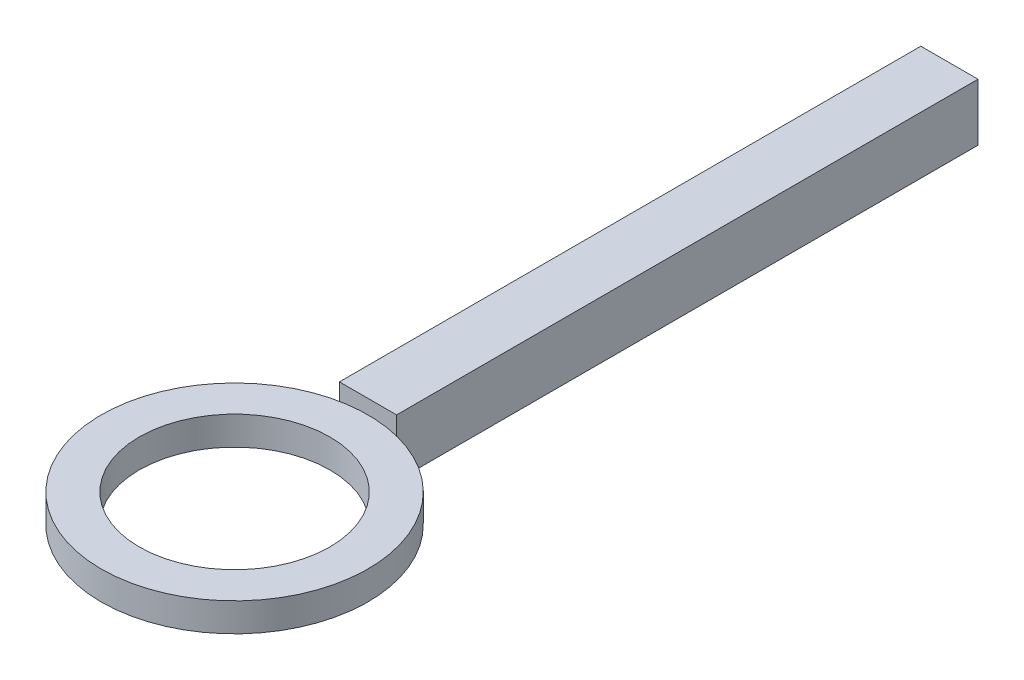
ISO-10303-21;
HEADER;
FILE_DESCRIPTION(('STEP AP214'),'2;1');
FILE_NAME('part.step','',(''),(''),'','','');
FILE_SCHEMA(('AUTOMOTIVE_DESIGN { 1 0 10303 214 1 1 1 1 }'));
ENDSEC;
DATA;
#1=APPLICATION_CONTEXT('core data for automotive mechanical design processes');
#2=APPLICATION_PROTOCOL_DEFINITION('international standard','automotive_design',2000,#1);
#3=PRODUCT_CONTEXT('',#1,'mechanical');
#4=PRODUCT('Part','Part','',(#3));
#5=PRODUCT_RELATED_PRODUCT_CATEGORY('part','',(#4));
#6=PRODUCT_DEFINITION_FORMATION('','',#4);
#7=PRODUCT_DEFINITION_CONTEXT('part definition',#1,'design');
#8=PRODUCT_DEFINITION('design','',#6,#7);
#9=PRODUCT_DEFINITION_SHAPE('','',#8);
#10=(LENGTH_UNIT() NAMED_UNIT(*) SI_UNIT(.MILLI.,.METRE.));
#11=(NAMED_UNIT(*) PLANE_ANGLE_UNIT() SI_UNIT($,.RADIAN.));
#12=(NAMED_UNIT(*) SI_UNIT($,.STERADIAN.) SOLID_ANGLE_UNIT());
#13=UNCERTAINTY_MEASURE_WITH_UNIT(LENGTH_MEASURE(1.E-05),#10,'distance_accuracy_value','');
#14=(GEOMETRIC_REPRESENTATION_CONTEXT(3) GLOBAL_UNCERTAINTY_ASSIGNED_CONTEXT((#13)) GLOBAL_UNIT_ASSIGNED_CONTEXT((#10,
#11,#12)) REPRESENTATION_CONTEXT('',''));
#15=CARTESIAN_POINT('',(0.,0.,0.));
#16=DIRECTION('',(0.,0.,1.));
#17=DIRECTION('',(1.,0.,0.));
#18=AXIS2_PLACEMENT_3D('',#15,#16,#17);
#19=CARTESIAN_POINT('',(-6.,6.,0.));
#20=DIRECTION('',(1.,0.,0.));
#21=DIRECTION('',(0.,0.,-1.));
#22=AXIS2_PLACEMENT_3D('',#19,#20,#21);
#23=PLANE('',#22);
#24=DIRECTION('',(0.,0.,1.));
#25=VECTOR('',#24,1.);
#26=CARTESIAN_POINT('',(-6.,-6.,0.));
#27=LINE('',#26,#25);
#28=CARTESIAN_POINT('',(-6.,-6.,0.));
#29=VERTEX_POINT('',#28);
#30=CARTESIAN_POINT('',(-6.,-6.,122.));
#31=VERTEX_POINT('',#30);
#32=EDGE_CURVE('E109',#29,#31,#27,.T.);
#33=ORIENTED_EDGE('',*,*,#32,.T.);
#34=DIRECTION('',(0.,-1.,0.));
#35=VECTOR('',#34,1.);
#36=CARTESIAN_POINT('',(-6.,6.,122.));
#37=LINE('',#36,#35);
#38=CARTESIAN_POINT('',(-6.,6.,122.));
#39=VERTEX_POINT('',#38);
#40=EDGE_CURVE('E12',#39,#31,#37,.T.);
#41=ORIENTED_EDGE('',*,*,#40,.F.);
#42=DIRECTION('',(0.,0.,1.));
#43=VECTOR('',#42,1.);
#44=CARTESIAN_POINT('',(-6.,6.,0.));
#45=LINE('',#44,#43);
#46=CARTESIAN_POINT('',(-6.,6.,0.));
#47=VERTEX_POINT('',#46);
#48=EDGE_CURVE('E98',#47,#39,#45,.T.);
#49=ORIENTED_EDGE('',*,*,#48,.F.);
#50=DIRECTION('',(0.,-1.,0.));
#51=VECTOR('',#50,1.);
#52=CARTESIAN_POINT('',(-6.,6.,0.));
#53=LINE('',#52,#51);
#54=EDGE_CURVE('E106',#47,#29,#53,.T.);
#55=ORIENTED_EDGE('',*,*,#54,.T.);
#56=EDGE_LOOP('',(#33,#41,#49,#55));
#57=FACE_BOUND('',#56,.T.);
#58=ADVANCED_FACE('F50',(#57),#23,.F.);
#59=CARTESIAN_POINT('',(-6.,6.,122.));
#60=DIRECTION('',(0.,0.,-1.));
#61=DIRECTION('',(-1.,0.,0.));
#62=AXIS2_PLACEMENT_3D('',#59,#60,#61);
#63=PLANE('',#62);
#64=DIRECTION('',(1.,0.,0.));
#65=VECTOR('',#64,1.);
#66=CARTESIAN_POINT('',(-6.,-6.,122.));
#67=LINE('',#66,#65);
#68=CARTESIAN_POINT('',(6.,-6.,122.));
#69=VERTEX_POINT('',#68);
#70=EDGE_CURVE('E105',#31,#69,#67,.T.);
#71=ORIENTED_EDGE('',*,*,#70,.T.);
#72=DIRECTION('',(0.,-1.,0.));
#73=VECTOR('',#72,1.);
#74=CARTESIAN_POINT('',(6.,6.,122.));
#75=LINE('',#74,#73);
#76=CARTESIAN_POINT('',(6.,6.,122.));
#77=VERTEX_POINT('',#76);
#78=EDGE_CURVE('E54',#77,#69,#75,.T.);
#79=ORIENTED_EDGE('',*,*,#78,.F.);
#80=DIRECTION('',(1.,0.,0.));
#81=VECTOR('',#80,1.);
#82=CARTESIAN_POINT('',(-6.,6.,122.));
#83=LINE('',#82,#81);
#84=EDGE_CURVE('E91',#39,#77,#83,.T.);
#85=ORIENTED_EDGE('',*,*,#84,.F.);
#86=ORIENTED_EDGE('',*,*,#40,.T.);
#87=EDGE_LOOP('',(#71,#79,#85,#86));
#88=FACE_BOUND('',#87,.T.);
#89=ADVANCED_FACE('F101',(#88),#63,.F.);
#90=CARTESIAN_POINT('',(6.,6.,122.));
#91=DIRECTION('',(-1.,0.,0.));
#92=DIRECTION('',(0.,0.,1.));
#93=AXIS2_PLACEMENT_3D('',#90,#91,#92);
#94=PLANE('',#93);
#95=DIRECTION('',(0.,0.,-1.));
#96=VECTOR('',#95,1.);
#97=CARTESIAN_POINT('',(6.,-6.,122.));
#98=LINE('',#97,#96);
#99=CARTESIAN_POINT('',(6.,-6.,0.));
#100=VERTEX_POINT('',#99);
#101=EDGE_CURVE('E78',#69,#100,#98,.T.);
#102=ORIENTED_EDGE('',*,*,#101,.T.);
#103=DIRECTION('',(0.,-1.,0.));
#104=VECTOR('',#103,1.);
#105=CARTESIAN_POINT('',(6.,6.,0.));
#106=LINE('',#105,#104);
#107=CARTESIAN_POINT('',(6.,6.,0.));
#108=VERTEX_POINT('',#107);
#109=EDGE_CURVE('E103',#108,#100,#106,.T.);
#110=ORIENTED_EDGE('',*,*,#109,.F.);
#111=DIRECTION('',(0.,0.,-1.));
#112=VECTOR('',#111,1.);
#113=CARTESIAN_POINT('',(6.,6.,122.));
#114=LINE('',#113,#112);
#115=EDGE_CURVE('E96',#77,#108,#114,.T.);
#116=ORIENTED_EDGE('',*,*,#115,.F.);
#117=ORIENTED_EDGE('',*,*,#78,.T.);
#118=EDGE_LOOP('',(#102,#110,#116,#117));
#119=FACE_BOUND('',#118,.T.);
#120=ADVANCED_FACE('F102',(#119),#94,.F.);
#121=CARTESIAN_POINT('',(6.,6.,0.));
#122=DIRECTION('',(0.,0.,1.));
#123=DIRECTION('',(1.,0.,0.));
#124=AXIS2_PLACEMENT_3D('',#121,#122,#123);
#125=PLANE('',#124);
#126=DIRECTION('',(-1.,0.,0.));
#127=VECTOR('',#126,1.);
#128=CARTESIAN_POINT('',(6.,-6.,0.));
#129=LINE('',#128,#127);
#130=EDGE_CURVE('E88',#100,#29,#129,.T.);
#131=ORIENTED_EDGE('',*,*,#130,.T.);
#132=ORIENTED_EDGE('',*,*,#54,.F.);
#133=DIRECTION('',(-1.,0.,0.));
#134=VECTOR('',#133,1.);
#135=CARTESIAN_POINT('',(6.,6.,0.));
#136=LINE('',#135,#134);
#137=EDGE_CURVE('E64',#108,#47,#136,.T.);
#138=ORIENTED_EDGE('',*,*,#137,.F.);
#139=ORIENTED_EDGE('',*,*,#109,.T.);
#140=EDGE_LOOP('',(#131,#132,#138,#139));
#141=FACE_BOUND('',#140,.T.);
#142=ADVANCED_FACE('F120',(#141),#125,.F.);
#143=CARTESIAN_POINT('',(0.,6.,0.));
#144=DIRECTION('',(0.,1.,0.));
#145=DIRECTION('',(0.,0.,1.));
#146=AXIS2_PLACEMENT_3D('',#143,#144,#145);
#147=PLANE('',#146);
#148=ORIENTED_EDGE('',*,*,#48,.T.);
#149=ORIENTED_EDGE('',*,*,#84,.T.);
#150=ORIENTED_EDGE('',*,*,#115,.T.);
#151=ORIENTED_EDGE('',*,*,#137,.T.);
#152=EDGE_LOOP('',(#148,#149,#150,#151));
#153=FACE_BOUND('',#152,.T.);
#154=ADVANCED_FACE('F94',(#153),#147,.T.);
#155=CARTESIAN_POINT('',(0.,-6.,0.));
#156=DIRECTION('',(0.,1.,0.));
#157=DIRECTION('',(0.,0.,1.));
#158=AXIS2_PLACEMENT_3D('',#155,#156,#157);
#159=PLANE('',#158);
#160=ORIENTED_EDGE('',*,*,#32,.F.);
#161=ORIENTED_EDGE('',*,*,#130,.F.);
#162=ORIENTED_EDGE('',*,*,#101,.F.);
#163=ORIENTED_EDGE('',*,*,#70,.F.);
#164=EDGE_LOOP('',(#160,#161,#162,#163));
#165=FACE_BOUND('',#164,.T.);
#166=ADVANCED_FACE('F118',(#165),#159,.F.);
#167=CLOSED_SHELL('',(#58,#89,#120,#142,#154,#166));
#168=MANIFOLD_SOLID_BREP('B2',#167);
#169=CARTESIAN_POINT('',(0.,3.,150.));
#170=DIRECTION('',(0.,1.,0.));
#171=DIRECTION('',(0.,0.,1.));
#172=AXIS2_PLACEMENT_3D('',#169,#170,#171);
#173=PLANE('',#172);
#174=CARTESIAN_POINT('',(0.,3.,150.));
#175=DIRECTION('',(0.,1.,0.));
#176=DIRECTION('',(0.,0.,1.));
#177=AXIS2_PLACEMENT_3D('',#174,#175,#176);
#178=CIRCLE('',#177,28.);
#179=CARTESIAN_POINT('',(0.,3.,178.));
#180=VERTEX_POINT('',#179);
#181=EDGE_CURVE('E46',#180,#180,#178,.T.);
#182=ORIENTED_EDGE('',*,*,#181,.T.);
#183=EDGE_LOOP('',(#182));
#184=FACE_BOUND('',#183,.T.);
#185=CARTESIAN_POINT('',(0.,3.,150.));
#186=DIRECTION('',(0.,1.,0.));
#187=DIRECTION('',(0.,0.,1.));
#188=AXIS2_PLACEMENT_3D('',#185,#186,#187);
#189=CIRCLE('',#188,20.);
#190=CARTESIAN_POINT('',(0.,3.,170.));
#191=VERTEX_POINT('',#190);
#192=EDGE_CURVE('E185',#191,#191,#189,.T.);
#193=ORIENTED_EDGE('',*,*,#192,.F.);
#194=EDGE_LOOP('',(#193));
#195=FACE_BOUND('',#194,.T.);
#196=ADVANCED_FACE('F172',(#184,#195),#173,.T.);
#197=CARTESIAN_POINT('',(0.,-3.,150.));
#198=DIRECTION('',(0.,1.,0.));
#199=DIRECTION('',(0.,0.,1.));
#200=AXIS2_PLACEMENT_3D('',#197,#198,#199);
#201=PLANE('',#200);
#202=CARTESIAN_POINT('',(0.,-3.,150.));
#203=DIRECTION('',(0.,1.,0.));
#204=DIRECTION('',(0.,0.,1.));
#205=AXIS2_PLACEMENT_3D('',#202,#203,#204);
#206=CIRCLE('',#205,28.);
#207=CARTESIAN_POINT('',(0.,-3.,178.));
#208=VERTEX_POINT('',#207);
#209=EDGE_CURVE('E173',#208,#208,#206,.T.);
#210=ORIENTED_EDGE('',*,*,#209,.F.);
#211=EDGE_LOOP('',(#210));
#212=FACE_BOUND('',#211,.T.);
#213=CARTESIAN_POINT('',(0.,-3.,150.));
#214=DIRECTION('',(0.,1.,0.));
#215=DIRECTION('',(0.,0.,1.));
#216=AXIS2_PLACEMENT_3D('',#213,#214,#215);
#217=CIRCLE('',#216,20.);
#218=CARTESIAN_POINT('',(0.,-3.,170.));
#219=VERTEX_POINT('',#218);
#220=EDGE_CURVE('E184',#219,#219,#217,.T.);
#221=ORIENTED_EDGE('',*,*,#220,.T.);
#222=EDGE_LOOP('',(#221));
#223=FACE_BOUND('',#222,.T.);
#224=ADVANCED_FACE('F193',(#212,#223),#201,.F.);
#225=CARTESIAN_POINT('',(0.,3.,150.));
#226=DIRECTION('',(0.,-1.,0.));
#227=DIRECTION('',(0.,0.,-1.));
#228=AXIS2_PLACEMENT_3D('',#225,#226,#227);
#229=CYLINDRICAL_SURFACE('',#228,28.);
#230=ORIENTED_EDGE('',*,*,#209,.T.);
#231=EDGE_LOOP('',(#230));
#232=FACE_BOUND('',#231,.T.);
#233=ORIENTED_EDGE('',*,*,#181,.F.);
#234=EDGE_LOOP('',(#233));
#235=FACE_BOUND('',#234,.T.);
#236=ADVANCED_FACE('F174',(#232,#235),#229,.T.);
#237=CARTESIAN_POINT('',(0.,3.,150.));
#238=DIRECTION('',(0.,-1.,0.));
#239=DIRECTION('',(0.,0.,-1.));
#240=AXIS2_PLACEMENT_3D('',#237,#238,#239);
#241=CYLINDRICAL_SURFACE('',#240,20.);
#242=ORIENTED_EDGE('',*,*,#192,.T.);
#243=EDGE_LOOP('',(#242));
#244=FACE_BOUND('',#243,.T.);
#245=ORIENTED_EDGE('',*,*,#220,.F.);
#246=EDGE_LOOP('',(#245));
#247=FACE_BOUND('',#246,.T.);
#248=ADVANCED_FACE('F188',(#244,#247),#241,.F.);
#249=CLOSED_SHELL('',(#196,#224,#236,#248));
#250=MANIFOLD_SOLID_BREP('B6',#249);
#251=ADVANCED_BREP_SHAPE_REPRESENTATION('',(#18,#168,#250),#14);
#252=SHAPE_DEFINITION_REPRESENTATION(#9,#251);
ENDSEC;
END-ISO-10303-21;
